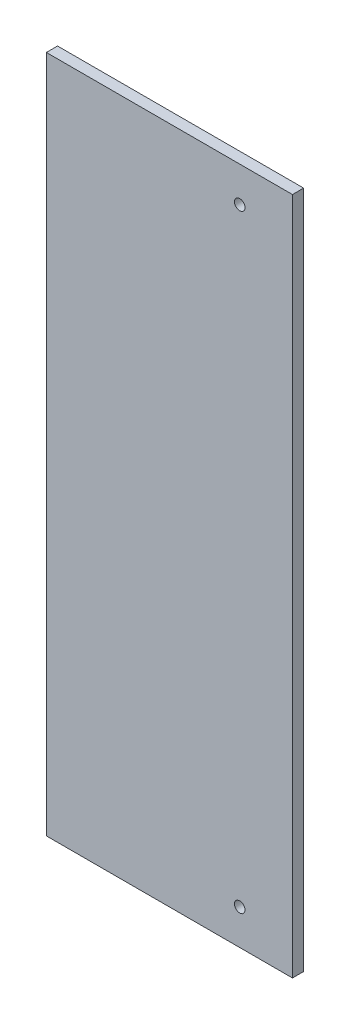
ISO-10303-21;
HEADER;
FILE_DESCRIPTION(('STEP AP214'),'2;1');
FILE_NAME('part.step','',(''),(''),'','','');
FILE_SCHEMA(('AUTOMOTIVE_DESIGN { 1 0 10303 214 1 1 1 1 }'));
ENDSEC;
DATA;
#1=APPLICATION_CONTEXT('core data for automotive mechanical design processes');
#2=APPLICATION_PROTOCOL_DEFINITION('international standard','automotive_design',2000,#1);
#3=PRODUCT_CONTEXT('',#1,'mechanical');
#4=PRODUCT('Part','Part','',(#3));
#5=PRODUCT_RELATED_PRODUCT_CATEGORY('part','',(#4));
#6=PRODUCT_DEFINITION_FORMATION('','',#4);
#7=PRODUCT_DEFINITION_CONTEXT('part definition',#1,'design');
#8=PRODUCT_DEFINITION('design','',#6,#7);
#9=PRODUCT_DEFINITION_SHAPE('','',#8);
#10=(LENGTH_UNIT() NAMED_UNIT(*) SI_UNIT(.MILLI.,.METRE.));
#11=(NAMED_UNIT(*) PLANE_ANGLE_UNIT() SI_UNIT($,.RADIAN.));
#12=(NAMED_UNIT(*) SI_UNIT($,.STERADIAN.) SOLID_ANGLE_UNIT());
#13=UNCERTAINTY_MEASURE_WITH_UNIT(LENGTH_MEASURE(1.E-05),#10,'distance_accuracy_value','');
#14=(GEOMETRIC_REPRESENTATION_CONTEXT(3) GLOBAL_UNCERTAINTY_ASSIGNED_CONTEXT((#13)) GLOBAL_UNIT_ASSIGNED_CONTEXT((#10,
#11,#12)) REPRESENTATION_CONTEXT('',''));
#15=CARTESIAN_POINT('',(0.,0.,0.));
#16=DIRECTION('',(0.,0.,1.));
#17=DIRECTION('',(1.,0.,0.));
#18=AXIS2_PLACEMENT_3D('',#15,#16,#17);
#19=CARTESIAN_POINT('',(0.,0.,3.175));
#20=DIRECTION('',(0.,0.,-1.));
#21=DIRECTION('',(-1.,0.,0.));
#22=AXIS2_PLACEMENT_3D('',#19,#20,#21);
#23=PLANE('',#22);
#24=DIRECTION('',(0.,-1.,0.));
#25=VECTOR('',#24,1.);
#26=CARTESIAN_POINT('',(0.,0.,3.175));
#27=LINE('',#26,#25);
#28=CARTESIAN_POINT('',(0.,193.,3.175));
#29=VERTEX_POINT('',#28);
#30=CARTESIAN_POINT('',(0.,0.,3.175));
#31=VERTEX_POINT('',#30);
#32=EDGE_CURVE('E90',#29,#31,#27,.T.);
#33=ORIENTED_EDGE('',*,*,#32,.T.);
#34=DIRECTION('',(1.,0.,0.));
#35=VECTOR('',#34,1.);
#36=CARTESIAN_POINT('',(0.,0.,3.175));
#37=LINE('',#36,#35);
#38=CARTESIAN_POINT('',(70.,0.,3.175));
#39=VERTEX_POINT('',#38);
#40=EDGE_CURVE('E85',#31,#39,#37,.T.);
#41=ORIENTED_EDGE('',*,*,#40,.T.);
#42=DIRECTION('',(0.,1.,0.));
#43=VECTOR('',#42,1.);
#44=CARTESIAN_POINT('',(70.,0.,3.175));
#45=LINE('',#44,#43);
#46=CARTESIAN_POINT('',(70.,193.,3.175));
#47=VERTEX_POINT('',#46);
#48=EDGE_CURVE('E88',#39,#47,#45,.T.);
#49=ORIENTED_EDGE('',*,*,#48,.T.);
#50=DIRECTION('',(-1.,0.,0.));
#51=VECTOR('',#50,1.);
#52=CARTESIAN_POINT('',(0.,193.,3.175));
#53=LINE('',#52,#51);
#54=EDGE_CURVE('E55',#47,#29,#53,.T.);
#55=ORIENTED_EDGE('',*,*,#54,.T.);
#56=EDGE_LOOP('',(#33,#41,#49,#55));
#57=FACE_BOUND('',#56,.T.);
#58=CARTESIAN_POINT('',(55.,183.,3.175));
#59=DIRECTION('',(0.,0.,1.));
#60=DIRECTION('',(1.,0.,0.));
#61=AXIS2_PLACEMENT_3D('',#58,#59,#60);
#62=CIRCLE('',#61,1.5);
#63=CARTESIAN_POINT('',(56.5,183.,3.175));
#64=VERTEX_POINT('',#63);
#65=EDGE_CURVE('E113',#64,#64,#62,.T.);
#66=ORIENTED_EDGE('',*,*,#65,.F.);
#67=EDGE_LOOP('',(#66));
#68=FACE_BOUND('',#67,.T.);
#69=CARTESIAN_POINT('',(55.,10.,3.175));
#70=DIRECTION('',(0.,0.,1.));
#71=DIRECTION('',(1.,0.,0.));
#72=AXIS2_PLACEMENT_3D('',#69,#70,#71);
#73=CIRCLE('',#72,1.5);
#74=CARTESIAN_POINT('',(56.5,10.,3.175));
#75=VERTEX_POINT('',#74);
#76=EDGE_CURVE('E123',#75,#75,#73,.T.);
#77=ORIENTED_EDGE('',*,*,#76,.F.);
#78=EDGE_LOOP('',(#77));
#79=FACE_BOUND('',#78,.T.);
#80=ADVANCED_FACE('F38',(#57,#68,#79),#23,.F.);
#81=CARTESIAN_POINT('',(0.,0.,0.));
#82=DIRECTION('',(0.,0.,-1.));
#83=DIRECTION('',(-1.,0.,0.));
#84=AXIS2_PLACEMENT_3D('',#81,#82,#83);
#85=PLANE('',#84);
#86=CARTESIAN_POINT('',(55.,183.,0.));
#87=DIRECTION('',(0.,0.,1.));
#88=DIRECTION('',(1.,0.,0.));
#89=AXIS2_PLACEMENT_3D('',#86,#87,#88);
#90=CIRCLE('',#89,1.5);
#91=CARTESIAN_POINT('',(56.5,183.,0.));
#92=VERTEX_POINT('',#91);
#93=EDGE_CURVE('E120',#92,#92,#90,.T.);
#94=ORIENTED_EDGE('',*,*,#93,.T.);
#95=EDGE_LOOP('',(#94));
#96=FACE_BOUND('',#95,.T.);
#97=DIRECTION('',(0.,-1.,0.));
#98=VECTOR('',#97,1.);
#99=CARTESIAN_POINT('',(0.,0.,0.));
#100=LINE('',#99,#98);
#101=CARTESIAN_POINT('',(0.,193.,0.));
#102=VERTEX_POINT('',#101);
#103=CARTESIAN_POINT('',(0.,0.,0.));
#104=VERTEX_POINT('',#103);
#105=EDGE_CURVE('E119',#102,#104,#100,.T.);
#106=ORIENTED_EDGE('',*,*,#105,.F.);
#107=DIRECTION('',(-1.,0.,0.));
#108=VECTOR('',#107,1.);
#109=CARTESIAN_POINT('',(0.,193.,0.));
#110=LINE('',#109,#108);
#111=CARTESIAN_POINT('',(70.,193.,0.));
#112=VERTEX_POINT('',#111);
#113=EDGE_CURVE('E78',#112,#102,#110,.T.);
#114=ORIENTED_EDGE('',*,*,#113,.F.);
#115=DIRECTION('',(0.,1.,0.));
#116=VECTOR('',#115,1.);
#117=CARTESIAN_POINT('',(70.,0.,0.));
#118=LINE('',#117,#116);
#119=CARTESIAN_POINT('',(70.,0.,0.));
#120=VERTEX_POINT('',#119);
#121=EDGE_CURVE('E72',#120,#112,#118,.T.);
#122=ORIENTED_EDGE('',*,*,#121,.F.);
#123=DIRECTION('',(1.,0.,0.));
#124=VECTOR('',#123,1.);
#125=CARTESIAN_POINT('',(0.,0.,0.));
#126=LINE('',#125,#124);
#127=EDGE_CURVE('E95',#104,#120,#126,.T.);
#128=ORIENTED_EDGE('',*,*,#127,.F.);
#129=EDGE_LOOP('',(#106,#114,#122,#128));
#130=FACE_BOUND('',#129,.T.);
#131=CARTESIAN_POINT('',(55.,10.,0.));
#132=DIRECTION('',(0.,0.,1.));
#133=DIRECTION('',(1.,0.,0.));
#134=AXIS2_PLACEMENT_3D('',#131,#132,#133);
#135=CIRCLE('',#134,1.5);
#136=CARTESIAN_POINT('',(56.5,10.,0.));
#137=VERTEX_POINT('',#136);
#138=EDGE_CURVE('E121',#137,#137,#135,.T.);
#139=ORIENTED_EDGE('',*,*,#138,.T.);
#140=EDGE_LOOP('',(#139));
#141=FACE_BOUND('',#140,.T.);
#142=ADVANCED_FACE('F134',(#96,#130,#141),#85,.T.);
#143=CARTESIAN_POINT('',(0.,0.,3.175));
#144=DIRECTION('',(1.,0.,0.));
#145=DIRECTION('',(0.,0.,-1.));
#146=AXIS2_PLACEMENT_3D('',#143,#144,#145);
#147=PLANE('',#146);
#148=ORIENTED_EDGE('',*,*,#105,.T.);
#149=DIRECTION('',(0.,0.,-1.));
#150=VECTOR('',#149,1.);
#151=CARTESIAN_POINT('',(0.,0.,3.175));
#152=LINE('',#151,#150);
#153=EDGE_CURVE('E12',#31,#104,#152,.T.);
#154=ORIENTED_EDGE('',*,*,#153,.F.);
#155=ORIENTED_EDGE('',*,*,#32,.F.);
#156=DIRECTION('',(0.,0.,-1.));
#157=VECTOR('',#156,1.);
#158=CARTESIAN_POINT('',(0.,193.,3.175));
#159=LINE('',#158,#157);
#160=EDGE_CURVE('E101',#29,#102,#159,.T.);
#161=ORIENTED_EDGE('',*,*,#160,.T.);
#162=EDGE_LOOP('',(#148,#154,#155,#161));
#163=FACE_BOUND('',#162,.T.);
#164=ADVANCED_FACE('F40',(#163),#147,.F.);
#165=CARTESIAN_POINT('',(0.,0.,3.175));
#166=DIRECTION('',(0.,1.,0.));
#167=DIRECTION('',(0.,0.,1.));
#168=AXIS2_PLACEMENT_3D('',#165,#166,#167);
#169=PLANE('',#168);
#170=ORIENTED_EDGE('',*,*,#127,.T.);
#171=DIRECTION('',(0.,0.,-1.));
#172=VECTOR('',#171,1.);
#173=CARTESIAN_POINT('',(70.,0.,3.175));
#174=LINE('',#173,#172);
#175=EDGE_CURVE('E47',#39,#120,#174,.T.);
#176=ORIENTED_EDGE('',*,*,#175,.F.);
#177=ORIENTED_EDGE('',*,*,#40,.F.);
#178=ORIENTED_EDGE('',*,*,#153,.T.);
#179=EDGE_LOOP('',(#170,#176,#177,#178));
#180=FACE_BOUND('',#179,.T.);
#181=ADVANCED_FACE('F94',(#180),#169,.F.);
#182=CARTESIAN_POINT('',(70.,0.,3.175));
#183=DIRECTION('',(-1.,0.,0.));
#184=DIRECTION('',(0.,0.,1.));
#185=AXIS2_PLACEMENT_3D('',#182,#183,#184);
#186=PLANE('',#185);
#187=ORIENTED_EDGE('',*,*,#121,.T.);
#188=DIRECTION('',(0.,0.,-1.));
#189=VECTOR('',#188,1.);
#190=CARTESIAN_POINT('',(70.,193.,3.175));
#191=LINE('',#190,#189);
#192=EDGE_CURVE('E96',#47,#112,#191,.T.);
#193=ORIENTED_EDGE('',*,*,#192,.F.);
#194=ORIENTED_EDGE('',*,*,#48,.F.);
#195=ORIENTED_EDGE('',*,*,#175,.T.);
#196=EDGE_LOOP('',(#187,#193,#194,#195));
#197=FACE_BOUND('',#196,.T.);
#198=ADVANCED_FACE('F97',(#197),#186,.F.);
#199=CARTESIAN_POINT('',(0.,193.,3.175));
#200=DIRECTION('',(0.,-1.,0.));
#201=DIRECTION('',(0.,0.,-1.));
#202=AXIS2_PLACEMENT_3D('',#199,#200,#201);
#203=PLANE('',#202);
#204=ORIENTED_EDGE('',*,*,#113,.T.);
#205=ORIENTED_EDGE('',*,*,#160,.F.);
#206=ORIENTED_EDGE('',*,*,#54,.F.);
#207=ORIENTED_EDGE('',*,*,#192,.T.);
#208=EDGE_LOOP('',(#204,#205,#206,#207));
#209=FACE_BOUND('',#208,.T.);
#210=ADVANCED_FACE('F131',(#209),#203,.F.);
#211=CARTESIAN_POINT('',(55.,183.,3.175));
#212=DIRECTION('',(0.,0.,-1.));
#213=DIRECTION('',(-1.,0.,0.));
#214=AXIS2_PLACEMENT_3D('',#211,#212,#213);
#215=CYLINDRICAL_SURFACE('',#214,1.5);
#216=ORIENTED_EDGE('',*,*,#65,.T.);
#217=EDGE_LOOP('',(#216));
#218=FACE_BOUND('',#217,.T.);
#219=ORIENTED_EDGE('',*,*,#93,.F.);
#220=EDGE_LOOP('',(#219));
#221=FACE_BOUND('',#220,.T.);
#222=ADVANCED_FACE('F150',(#218,#221),#215,.F.);
#223=CARTESIAN_POINT('',(55.,10.,3.175));
#224=DIRECTION('',(0.,0.,-1.));
#225=DIRECTION('',(-1.,0.,0.));
#226=AXIS2_PLACEMENT_3D('',#223,#224,#225);
#227=CYLINDRICAL_SURFACE('',#226,1.5);
#228=ORIENTED_EDGE('',*,*,#76,.T.);
#229=EDGE_LOOP('',(#228));
#230=FACE_BOUND('',#229,.T.);
#231=ORIENTED_EDGE('',*,*,#138,.F.);
#232=EDGE_LOOP('',(#231));
#233=FACE_BOUND('',#232,.T.);
#234=ADVANCED_FACE('F170',(#230,#233),#227,.F.);
#235=CLOSED_SHELL('',(#80,#142,#164,#181,#198,#210,#222,#234));
#236=MANIFOLD_SOLID_BREP('B2',#235);
#237=ADVANCED_BREP_SHAPE_REPRESENTATION('',(#18,#236),#14);
#238=SHAPE_DEFINITION_REPRESENTATION(#9,#237);
ENDSEC;
END-ISO-10303-21;
